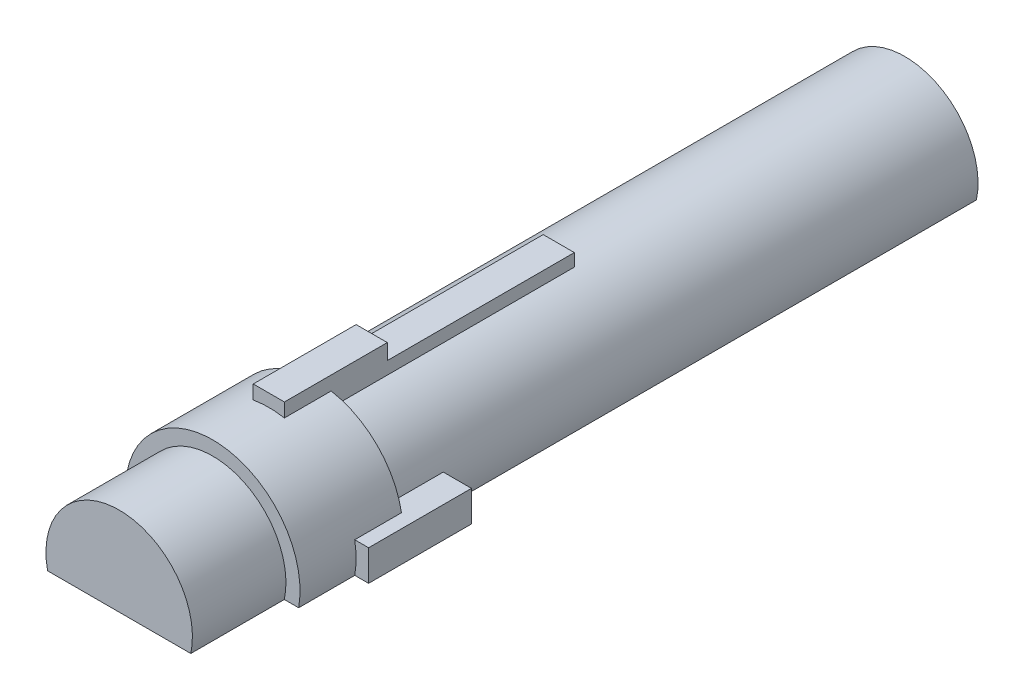
ISO-10303-21;
HEADER;
FILE_DESCRIPTION(('STEP AP214'),'2;1');
FILE_NAME('part.step','',(''),(''),'','','');
FILE_SCHEMA(('AUTOMOTIVE_DESIGN { 1 0 10303 214 1 1 1 1 }'));
ENDSEC;
DATA;
#1=APPLICATION_CONTEXT('core data for automotive mechanical design processes');
#2=APPLICATION_PROTOCOL_DEFINITION('international standard','automotive_design',2000,#1);
#3=PRODUCT_CONTEXT('',#1,'mechanical');
#4=PRODUCT('Part','Part','',(#3));
#5=PRODUCT_RELATED_PRODUCT_CATEGORY('part','',(#4));
#6=PRODUCT_DEFINITION_FORMATION('','',#4);
#7=PRODUCT_DEFINITION_CONTEXT('part definition',#1,'design');
#8=PRODUCT_DEFINITION('design','',#6,#7);
#9=PRODUCT_DEFINITION_SHAPE('','',#8);
#10=(LENGTH_UNIT() NAMED_UNIT(*) SI_UNIT(.MILLI.,.METRE.));
#11=(NAMED_UNIT(*) PLANE_ANGLE_UNIT() SI_UNIT($,.RADIAN.));
#12=(NAMED_UNIT(*) SI_UNIT($,.STERADIAN.) SOLID_ANGLE_UNIT());
#13=UNCERTAINTY_MEASURE_WITH_UNIT(LENGTH_MEASURE(1.E-05),#10,'distance_accuracy_value','');
#14=(GEOMETRIC_REPRESENTATION_CONTEXT(3) GLOBAL_UNCERTAINTY_ASSIGNED_CONTEXT((#13)) GLOBAL_UNIT_ASSIGNED_CONTEXT((#10,
#11,#12)) REPRESENTATION_CONTEXT('',''));
#15=CARTESIAN_POINT('',(0.,0.,0.));
#16=DIRECTION('',(0.,0.,1.));
#17=DIRECTION('',(1.,0.,0.));
#18=AXIS2_PLACEMENT_3D('',#15,#16,#17);
#19=CARTESIAN_POINT('',(0.,0.,42.));
#20=DIRECTION('',(0.,0.,-1.));
#21=DIRECTION('',(-1.,0.,0.));
#22=AXIS2_PLACEMENT_3D('',#19,#20,#21);
#23=CYLINDRICAL_SURFACE('',#22,3.915);
#24=CARTESIAN_POINT('',(0.,0.,18.5));
#25=DIRECTION('',(0.,0.,-1.));
#26=DIRECTION('',(-1.,0.,0.));
#27=AXIS2_PLACEMENT_3D('',#24,#25,#26);
#28=CIRCLE('',#27,3.915);
#29=CARTESIAN_POINT('',(-0.8333333333,3.82528176159758,18.5));
#30=VERTEX_POINT('',#29);
#31=CARTESIAN_POINT('',(0.8333333333,3.82528176159758,18.5));
#32=VERTEX_POINT('',#31);
#33=EDGE_CURVE('E11',#30,#32,#28,.T.);
#34=ORIENTED_EDGE('',*,*,#33,.T.);
#35=DIRECTION('',(0.,0.,1.));
#36=VECTOR('',#35,1.);
#37=CARTESIAN_POINT('',(0.833333333329999,3.82528176159105,28.5));
#38=LINE('',#37,#36);
#39=CARTESIAN_POINT('',(0.833333333329999,3.82528176159105,31.5));
#40=VERTEX_POINT('',#39);
#41=EDGE_CURVE('E304',#32,#40,#38,.T.);
#42=ORIENTED_EDGE('',*,*,#41,.T.);
#43=CARTESIAN_POINT('',(0.,0.,31.5));
#44=DIRECTION('',(0.,0.,1.));
#45=DIRECTION('',(1.,0.,0.));
#46=AXIS2_PLACEMENT_3D('',#43,#44,#45);
#47=CIRCLE('',#46,3.915);
#48=CARTESIAN_POINT('',(3.82528176159105,0.833333333330001,31.5));
#49=VERTEX_POINT('',#48);
#50=EDGE_CURVE('E364',#49,#40,#47,.T.);
#51=ORIENTED_EDGE('',*,*,#50,.F.);
#52=DIRECTION('',(0.,0.,1.));
#53=VECTOR('',#52,1.);
#54=CARTESIAN_POINT('',(3.82528176159105,0.833333333330001,28.5));
#55=LINE('',#54,#53);
#56=CARTESIAN_POINT('',(3.82528176159105,0.833333333330001,28.5));
#57=VERTEX_POINT('',#56);
#58=EDGE_CURVE('E308',#57,#49,#55,.T.);
#59=ORIENTED_EDGE('',*,*,#58,.F.);
#60=CARTESIAN_POINT('',(0.,0.,28.5));
#61=DIRECTION('',(0.,0.,-1.));
#62=DIRECTION('',(-1.,0.,0.));
#63=AXIS2_PLACEMENT_3D('',#60,#61,#62);
#64=CIRCLE('',#63,3.915);
#65=CARTESIAN_POINT('',(3.82909661139217,-0.815625,28.5));
#66=VERTEX_POINT('',#65);
#67=EDGE_CURVE('E336',#57,#66,#64,.T.);
#68=ORIENTED_EDGE('',*,*,#67,.T.);
#69=DIRECTION('',(0.,0.,-1.));
#70=VECTOR('',#69,1.);
#71=CARTESIAN_POINT('',(3.82909661139217,-0.815625,42.));
#72=LINE('',#71,#70);
#73=CARTESIAN_POINT('',(3.82909661139217,-0.815625,0.));
#74=VERTEX_POINT('',#73);
#75=EDGE_CURVE('E373',#66,#74,#72,.T.);
#76=ORIENTED_EDGE('',*,*,#75,.T.);
#77=CARTESIAN_POINT('',(0.,0.,0.));
#78=DIRECTION('',(0.,0.,1.));
#79=DIRECTION('',(1.,0.,0.));
#80=AXIS2_PLACEMENT_3D('',#77,#78,#79);
#81=CIRCLE('',#80,3.915);
#82=CARTESIAN_POINT('',(-3.82909661139217,-0.815625,0.));
#83=VERTEX_POINT('',#82);
#84=EDGE_CURVE('E374',#74,#83,#81,.T.);
#85=ORIENTED_EDGE('',*,*,#84,.T.);
#86=DIRECTION('',(0.,0.,-1.));
#87=VECTOR('',#86,1.);
#88=CARTESIAN_POINT('',(-3.82909661139217,-0.815625,42.));
#89=LINE('',#88,#87);
#90=CARTESIAN_POINT('',(-3.82909661139217,-0.815625,28.5));
#91=VERTEX_POINT('',#90);
#92=EDGE_CURVE('E385',#91,#83,#89,.T.);
#93=ORIENTED_EDGE('',*,*,#92,.F.);
#94=CARTESIAN_POINT('',(-3.82528176159105,0.833333333329999,28.5));
#95=VERTEX_POINT('',#94);
#96=EDGE_CURVE('E332',#91,#95,#64,.T.);
#97=ORIENTED_EDGE('',*,*,#96,.T.);
#98=DIRECTION('',(0.,0.,1.));
#99=VECTOR('',#98,1.);
#100=CARTESIAN_POINT('',(-3.82528176159105,0.833333333329999,28.5));
#101=LINE('',#100,#99);
#102=CARTESIAN_POINT('',(-3.82528176159105,0.833333333329999,31.5));
#103=VERTEX_POINT('',#102);
#104=EDGE_CURVE('E290',#95,#103,#101,.T.);
#105=ORIENTED_EDGE('',*,*,#104,.T.);
#106=CARTESIAN_POINT('',(-0.83333333333,3.82528176159105,31.5));
#107=VERTEX_POINT('',#106);
#108=EDGE_CURVE('E360',#107,#103,#47,.T.);
#109=ORIENTED_EDGE('',*,*,#108,.F.);
#110=DIRECTION('',(0.,0.,1.));
#111=VECTOR('',#110,1.);
#112=CARTESIAN_POINT('',(-0.83333333333,3.82528176159105,28.5));
#113=LINE('',#112,#111);
#114=EDGE_CURVE('E294',#30,#107,#113,.T.);
#115=ORIENTED_EDGE('',*,*,#114,.F.);
#116=EDGE_LOOP('',(#34,#42,#51,#59,#68,#76,#85,#93,#97,#105,#109,#115));
#117=FACE_BOUND('',#116,.T.);
#118=ADVANCED_FACE('F45',(#117),#23,.T.);
#119=CARTESIAN_POINT('',(0.,0.,28.5));
#120=DIRECTION('',(0.,0.,-1.));
#121=DIRECTION('',(-1.,0.,0.));
#122=AXIS2_PLACEMENT_3D('',#119,#120,#121);
#123=PLANE('',#122);
#124=DIRECTION('',(0.,1.,0.));
#125=VECTOR('',#124,1.);
#126=CARTESIAN_POINT('',(0.833333333329999,5.33333333333333,28.5));
#127=LINE('',#126,#125);
#128=CARTESIAN_POINT('',(0.8333333333,4.5,28.5));
#129=VERTEX_POINT('',#128);
#130=CARTESIAN_POINT('',(0.833333333329999,5.33333333333333,28.5));
#131=VERTEX_POINT('',#130);
#132=EDGE_CURVE('E264',#129,#131,#127,.T.);
#133=ORIENTED_EDGE('',*,*,#132,.F.);
#134=DIRECTION('',(1.,0.,0.));
#135=VECTOR('',#134,1.);
#136=CARTESIAN_POINT('',(-0.8333333333,4.5,28.5));
#137=LINE('',#136,#135);
#138=CARTESIAN_POINT('',(-0.83333333333,4.5,28.5));
#139=VERTEX_POINT('',#138);
#140=EDGE_CURVE('E223',#139,#129,#137,.T.);
#141=ORIENTED_EDGE('',*,*,#140,.F.);
#142=DIRECTION('',(0.,-1.,0.));
#143=VECTOR('',#142,1.);
#144=CARTESIAN_POINT('',(-0.833333333330001,5.33333333333333,28.5));
#145=LINE('',#144,#143);
#146=CARTESIAN_POINT('',(-0.833333333330001,5.33333333333333,28.5));
#147=VERTEX_POINT('',#146);
#148=EDGE_CURVE('E209',#147,#139,#145,.T.);
#149=ORIENTED_EDGE('',*,*,#148,.F.);
#150=DIRECTION('',(-1.,0.,0.));
#151=VECTOR('',#150,1.);
#152=CARTESIAN_POINT('',(-0.833333333330001,5.33333333333333,28.5));
#153=LINE('',#152,#151);
#154=EDGE_CURVE('E267',#131,#147,#153,.T.);
#155=ORIENTED_EDGE('',*,*,#154,.F.);
#156=EDGE_LOOP('',(#133,#141,#149,#155));
#157=FACE_BOUND('',#156,.T.);
#158=ADVANCED_FACE('F494',(#157),#123,.T.);
#159=CARTESIAN_POINT('',(0.,0.,31.5));
#160=DIRECTION('',(0.,0.,1.));
#161=DIRECTION('',(1.,0.,0.));
#162=AXIS2_PLACEMENT_3D('',#159,#160,#161);
#163=PLANE('',#162);
#164=ORIENTED_EDGE('',*,*,#108,.T.);
#165=DIRECTION('',(-1.,0.,0.));
#166=VECTOR('',#165,1.);
#167=CARTESIAN_POINT('',(0.,0.83333333333,31.5));
#168=LINE('',#167,#166);
#169=CARTESIAN_POINT('',(-4.59165910458482,0.833333333329999,31.5));
#170=VERTEX_POINT('',#169);
#171=EDGE_CURVE('E328',#103,#170,#168,.T.);
#172=ORIENTED_EDGE('',*,*,#171,.T.);
#173=CARTESIAN_POINT('',(0.,0.,31.5));
#174=DIRECTION('',(0.,0.,1.));
#175=DIRECTION('',(1.,0.,0.));
#176=AXIS2_PLACEMENT_3D('',#173,#174,#175);
#177=CIRCLE('',#176,4.6666666666);
#178=CARTESIAN_POINT('',(-0.83333333333,4.59165910458482,31.5));
#179=VERTEX_POINT('',#178);
#180=EDGE_CURVE('E337',#179,#170,#177,.T.);
#181=ORIENTED_EDGE('',*,*,#180,.F.);
#182=DIRECTION('',(0.,-1.,0.));
#183=VECTOR('',#182,1.);
#184=CARTESIAN_POINT('',(-0.833333333329999,0.,31.5));
#185=LINE('',#184,#183);
#186=EDGE_CURVE('E324',#179,#107,#185,.T.);
#187=ORIENTED_EDGE('',*,*,#186,.T.);
#188=EDGE_LOOP('',(#164,#172,#181,#187));
#189=FACE_BOUND('',#188,.T.);
#190=ADVANCED_FACE('F433',(#189),#163,.F.);
#191=CARTESIAN_POINT('',(3.82909661139217,-0.815625,42.));
#192=VERTEX_POINT('',#191);
#193=CARTESIAN_POINT('',(3.82909661139217,-0.815625,37.));
#194=VERTEX_POINT('',#193);
#195=EDGE_CURVE('E381',#192,#194,#72,.T.);
#196=ORIENTED_EDGE('',*,*,#195,.T.);
#197=CARTESIAN_POINT('',(0.,0.,37.));
#198=DIRECTION('',(0.,0.,1.));
#199=DIRECTION('',(1.,0.,0.));
#200=AXIS2_PLACEMENT_3D('',#197,#198,#199);
#201=CIRCLE('',#200,3.915);
#202=CARTESIAN_POINT('',(-3.82909661139217,-0.815625,37.));
#203=VERTEX_POINT('',#202);
#204=EDGE_CURVE('E353',#194,#203,#201,.T.);
#205=ORIENTED_EDGE('',*,*,#204,.T.);
#206=CARTESIAN_POINT('',(-3.82909661139217,-0.815625,42.));
#207=VERTEX_POINT('',#206);
#208=EDGE_CURVE('E386',#207,#203,#89,.T.);
#209=ORIENTED_EDGE('',*,*,#208,.F.);
#210=CARTESIAN_POINT('',(0.,0.,42.));
#211=DIRECTION('',(0.,0.,1.));
#212=DIRECTION('',(1.,0.,0.));
#213=AXIS2_PLACEMENT_3D('',#210,#211,#212);
#214=CIRCLE('',#213,3.915);
#215=EDGE_CURVE('E365',#192,#207,#214,.T.);
#216=ORIENTED_EDGE('',*,*,#215,.F.);
#217=EDGE_LOOP('',(#196,#205,#209,#216));
#218=FACE_BOUND('',#217,.T.);
#219=ADVANCED_FACE('F47',(#218),#23,.T.);
#220=CARTESIAN_POINT('',(3.82909661139217,-0.815625,42.));
#221=DIRECTION('',(0.,1.,0.));
#222=DIRECTION('',(0.,0.,1.));
#223=AXIS2_PLACEMENT_3D('',#220,#221,#222);
#224=PLANE('',#223);
#225=DIRECTION('',(1.,0.,0.));
#226=VECTOR('',#225,1.);
#227=CARTESIAN_POINT('',(5.33333333333,-0.815625,28.5));
#228=LINE('',#227,#226);
#229=CARTESIAN_POINT('',(-5.33333333333,-0.815625,28.5));
#230=VERTEX_POINT('',#229);
#231=EDGE_CURVE('E252',#230,#91,#228,.T.);
#232=ORIENTED_EDGE('',*,*,#231,.T.);
#233=ORIENTED_EDGE('',*,*,#92,.T.);
#234=DIRECTION('',(1.,0.,0.));
#235=VECTOR('',#234,1.);
#236=CARTESIAN_POINT('',(3.82909661139217,-0.815625,0.));
#237=LINE('',#236,#235);
#238=EDGE_CURVE('E370',#83,#74,#237,.T.);
#239=ORIENTED_EDGE('',*,*,#238,.T.);
#240=ORIENTED_EDGE('',*,*,#75,.F.);
#241=CARTESIAN_POINT('',(5.33333333333,-0.815625,28.5));
#242=VERTEX_POINT('',#241);
#243=EDGE_CURVE('E251',#66,#242,#228,.T.);
#244=ORIENTED_EDGE('',*,*,#243,.T.);
#245=DIRECTION('',(0.,0.,1.));
#246=VECTOR('',#245,1.);
#247=CARTESIAN_POINT('',(5.33333333333,-0.815625,28.5));
#248=LINE('',#247,#246);
#249=CARTESIAN_POINT('',(5.33333333333,-0.815625,34.));
#250=VERTEX_POINT('',#249);
#251=EDGE_CURVE('E281',#242,#250,#248,.T.);
#252=ORIENTED_EDGE('',*,*,#251,.T.);
#253=DIRECTION('',(1.,0.,0.));
#254=VECTOR('',#253,1.);
#255=CARTESIAN_POINT('',(5.33333333333,-0.815625,34.));
#256=LINE('',#255,#254);
#257=CARTESIAN_POINT('',(4.59483771601681,-0.815625,34.));
#258=VERTEX_POINT('',#257);
#259=EDGE_CURVE('E211',#258,#250,#256,.T.);
#260=ORIENTED_EDGE('',*,*,#259,.F.);
#261=DIRECTION('',(0.,0.,1.));
#262=VECTOR('',#261,1.);
#263=CARTESIAN_POINT('',(4.59483771601681,-0.815625,31.5));
#264=LINE('',#263,#262);
#265=CARTESIAN_POINT('',(4.59483771601681,-0.815625,37.));
#266=VERTEX_POINT('',#265);
#267=EDGE_CURVE('E350',#258,#266,#264,.T.);
#268=ORIENTED_EDGE('',*,*,#267,.T.);
#269=DIRECTION('',(1.,0.,0.));
#270=VECTOR('',#269,1.);
#271=CARTESIAN_POINT('',(4.59483771601681,-0.815625,37.));
#272=LINE('',#271,#270);
#273=EDGE_CURVE('E347',#194,#266,#272,.T.);
#274=ORIENTED_EDGE('',*,*,#273,.F.);
#275=ORIENTED_EDGE('',*,*,#195,.F.);
#276=DIRECTION('',(1.,0.,0.));
#277=VECTOR('',#276,1.);
#278=CARTESIAN_POINT('',(3.82909661139217,-0.815625,42.));
#279=LINE('',#278,#277);
#280=EDGE_CURVE('E369',#207,#192,#279,.T.);
#281=ORIENTED_EDGE('',*,*,#280,.F.);
#282=ORIENTED_EDGE('',*,*,#208,.T.);
#283=CARTESIAN_POINT('',(-4.59483771601681,-0.815624999999999,37.));
#284=VERTEX_POINT('',#283);
#285=EDGE_CURVE('E342',#284,#203,#272,.T.);
#286=ORIENTED_EDGE('',*,*,#285,.F.);
#287=DIRECTION('',(0.,0.,1.));
#288=VECTOR('',#287,1.);
#289=CARTESIAN_POINT('',(-4.59483771601681,-0.815624999999999,31.5));
#290=LINE('',#289,#288);
#291=CARTESIAN_POINT('',(-4.59483771601681,-0.815624999999999,34.));
#292=VERTEX_POINT('',#291);
#293=EDGE_CURVE('E354',#292,#284,#290,.T.);
#294=ORIENTED_EDGE('',*,*,#293,.F.);
#295=CARTESIAN_POINT('',(-5.33333333333,-0.815625,34.));
#296=VERTEX_POINT('',#295);
#297=EDGE_CURVE('E226',#296,#292,#256,.T.);
#298=ORIENTED_EDGE('',*,*,#297,.F.);
#299=DIRECTION('',(0.,0.,1.));
#300=VECTOR('',#299,1.);
#301=CARTESIAN_POINT('',(-5.33333333333,-0.815625,28.5));
#302=LINE('',#301,#300);
#303=EDGE_CURVE('E282',#230,#296,#302,.T.);
#304=ORIENTED_EDGE('',*,*,#303,.F.);
#305=EDGE_LOOP('',(#232,#233,#239,#240,#244,#252,#260,#268,#274,#275,#281,#282,#286,#294,#298,#304));
#306=FACE_BOUND('',#305,.T.);
#307=ADVANCED_FACE('F454',(#306),#224,.F.);
#308=CARTESIAN_POINT('',(0.,0.,42.));
#309=DIRECTION('',(0.,0.,1.));
#310=DIRECTION('',(1.,0.,0.));
#311=AXIS2_PLACEMENT_3D('',#308,#309,#310);
#312=PLANE('',#311);
#313=ORIENTED_EDGE('',*,*,#215,.T.);
#314=ORIENTED_EDGE('',*,*,#280,.T.);
#315=EDGE_LOOP('',(#313,#314));
#316=FACE_BOUND('',#315,.T.);
#317=ADVANCED_FACE('F531',(#316),#312,.T.);
#318=CARTESIAN_POINT('',(0.,0.,0.));
#319=DIRECTION('',(0.,0.,1.));
#320=DIRECTION('',(1.,0.,0.));
#321=AXIS2_PLACEMENT_3D('',#318,#319,#320);
#322=PLANE('',#321);
#323=ORIENTED_EDGE('',*,*,#84,.F.);
#324=ORIENTED_EDGE('',*,*,#238,.F.);
#325=EDGE_LOOP('',(#323,#324));
#326=FACE_BOUND('',#325,.T.);
#327=ADVANCED_FACE('F526',(#326),#322,.F.);
#328=ORIENTED_EDGE('',*,*,#50,.T.);
#329=DIRECTION('',(0.,1.,0.));
#330=VECTOR('',#329,1.);
#331=CARTESIAN_POINT('',(0.833333333329999,0.,31.5));
#332=LINE('',#331,#330);
#333=CARTESIAN_POINT('',(0.833333333329999,4.59165910458482,31.5));
#334=VERTEX_POINT('',#333);
#335=EDGE_CURVE('E320',#40,#334,#332,.T.);
#336=ORIENTED_EDGE('',*,*,#335,.T.);
#337=CARTESIAN_POINT('',(4.59165910458482,0.833333333330001,31.5));
#338=VERTEX_POINT('',#337);
#339=EDGE_CURVE('E341',#338,#334,#177,.T.);
#340=ORIENTED_EDGE('',*,*,#339,.F.);
#341=DIRECTION('',(-1.,0.,0.));
#342=VECTOR('',#341,1.);
#343=CARTESIAN_POINT('',(0.,0.833333333330001,31.5));
#344=LINE('',#343,#342);
#345=EDGE_CURVE('E285',#338,#49,#344,.T.);
#346=ORIENTED_EDGE('',*,*,#345,.T.);
#347=EDGE_LOOP('',(#328,#336,#340,#346));
#348=FACE_BOUND('',#347,.T.);
#349=ADVANCED_FACE('F491',(#348),#163,.F.);
#350=CARTESIAN_POINT('',(0.,0.,37.));
#351=DIRECTION('',(0.,0.,1.));
#352=DIRECTION('',(1.,0.,0.));
#353=AXIS2_PLACEMENT_3D('',#350,#351,#352);
#354=PLANE('',#353);
#355=ORIENTED_EDGE('',*,*,#204,.F.);
#356=ORIENTED_EDGE('',*,*,#273,.T.);
#357=CARTESIAN_POINT('',(0.,0.,37.));
#358=DIRECTION('',(0.,0.,1.));
#359=DIRECTION('',(1.,0.,0.));
#360=AXIS2_PLACEMENT_3D('',#357,#358,#359);
#361=CIRCLE('',#360,4.6666666666);
#362=EDGE_CURVE('E343',#266,#284,#361,.T.);
#363=ORIENTED_EDGE('',*,*,#362,.T.);
#364=ORIENTED_EDGE('',*,*,#285,.T.);
#365=EDGE_LOOP('',(#355,#356,#363,#364));
#366=FACE_BOUND('',#365,.T.);
#367=ADVANCED_FACE('F457',(#366),#354,.T.);
#368=CARTESIAN_POINT('',(0.,0.,31.5));
#369=DIRECTION('',(0.,0.,1.));
#370=DIRECTION('',(1.,0.,0.));
#371=AXIS2_PLACEMENT_3D('',#368,#369,#370);
#372=CYLINDRICAL_SURFACE('',#371,4.6666666666);
#373=DIRECTION('',(0.,0.,1.));
#374=VECTOR('',#373,1.);
#375=CARTESIAN_POINT('',(4.59165910458482,0.833333333330001,31.5));
#376=LINE('',#375,#374);
#377=CARTESIAN_POINT('',(4.59165910458482,0.833333333330001,34.));
#378=VERTEX_POINT('',#377);
#379=EDGE_CURVE('E54',#338,#378,#376,.T.);
#380=ORIENTED_EDGE('',*,*,#379,.F.);
#381=ORIENTED_EDGE('',*,*,#339,.T.);
#382=DIRECTION('',(0.,0.,1.));
#383=VECTOR('',#382,1.);
#384=CARTESIAN_POINT('',(0.833333333329999,4.59165910458482,31.5));
#385=LINE('',#384,#383);
#386=CARTESIAN_POINT('',(0.833333333329999,4.59165910458482,34.));
#387=VERTEX_POINT('',#386);
#388=EDGE_CURVE('E399',#387,#334,#385,.F.);
#389=ORIENTED_EDGE('',*,*,#388,.F.);
#390=CARTESIAN_POINT('',(0.,0.,34.));
#391=DIRECTION('',(0.,0.,-1.));
#392=DIRECTION('',(-1.,0.,0.));
#393=AXIS2_PLACEMENT_3D('',#390,#391,#392);
#394=CIRCLE('',#393,4.6666666666);
#395=CARTESIAN_POINT('',(-0.83333333333,4.59165910458482,34.));
#396=VERTEX_POINT('',#395);
#397=EDGE_CURVE('E396',#387,#396,#394,.F.);
#398=ORIENTED_EDGE('',*,*,#397,.T.);
#399=DIRECTION('',(0.,0.,1.));
#400=VECTOR('',#399,1.);
#401=CARTESIAN_POINT('',(-0.83333333333,4.59165910458482,31.5));
#402=LINE('',#401,#400);
#403=EDGE_CURVE('E402',#179,#396,#402,.T.);
#404=ORIENTED_EDGE('',*,*,#403,.F.);
#405=ORIENTED_EDGE('',*,*,#180,.T.);
#406=DIRECTION('',(0.,0.,1.));
#407=VECTOR('',#406,1.);
#408=CARTESIAN_POINT('',(-4.59165910458482,0.833333333329999,31.5));
#409=LINE('',#408,#407);
#410=CARTESIAN_POINT('',(-4.59165910458482,0.833333333329999,34.));
#411=VERTEX_POINT('',#410);
#412=EDGE_CURVE('E394',#411,#170,#409,.F.);
#413=ORIENTED_EDGE('',*,*,#412,.F.);
#414=EDGE_CURVE('E390',#411,#292,#394,.F.);
#415=ORIENTED_EDGE('',*,*,#414,.T.);
#416=ORIENTED_EDGE('',*,*,#293,.T.);
#417=ORIENTED_EDGE('',*,*,#362,.F.);
#418=ORIENTED_EDGE('',*,*,#267,.F.);
#419=EDGE_CURVE('E395',#258,#378,#394,.F.);
#420=ORIENTED_EDGE('',*,*,#419,.T.);
#421=EDGE_LOOP('',(#380,#381,#389,#398,#404,#405,#413,#415,#416,#417,#418,#420));
#422=FACE_BOUND('',#421,.T.);
#423=ADVANCED_FACE('F416',(#422),#372,.T.);
#424=CARTESIAN_POINT('',(-5.33333333333,0.833333333329999,28.5));
#425=DIRECTION('',(-1.,0.,0.));
#426=DIRECTION('',(0.,0.,1.));
#427=AXIS2_PLACEMENT_3D('',#424,#425,#426);
#428=PLANE('',#427);
#429=ORIENTED_EDGE('',*,*,#303,.T.);
#430=DIRECTION('',(0.,-1.,0.));
#431=VECTOR('',#430,1.);
#432=CARTESIAN_POINT('',(-5.33333333333,0.833333333329999,34.));
#433=LINE('',#432,#431);
#434=CARTESIAN_POINT('',(-5.33333333333,0.833333333329999,34.));
#435=VERTEX_POINT('',#434);
#436=EDGE_CURVE('E247',#435,#296,#433,.T.);
#437=ORIENTED_EDGE('',*,*,#436,.F.);
#438=DIRECTION('',(0.,0.,1.));
#439=VECTOR('',#438,1.);
#440=CARTESIAN_POINT('',(-5.33333333333,0.833333333329999,28.5));
#441=LINE('',#440,#439);
#442=CARTESIAN_POINT('',(-5.33333333333,0.833333333329999,28.5));
#443=VERTEX_POINT('',#442);
#444=EDGE_CURVE('E286',#443,#435,#441,.T.);
#445=ORIENTED_EDGE('',*,*,#444,.F.);
#446=DIRECTION('',(0.,-1.,0.));
#447=VECTOR('',#446,1.);
#448=CARTESIAN_POINT('',(-5.33333333333,0.833333333329999,28.5));
#449=LINE('',#448,#447);
#450=EDGE_CURVE('E277',#443,#230,#449,.T.);
#451=ORIENTED_EDGE('',*,*,#450,.T.);
#452=EDGE_LOOP('',(#429,#437,#445,#451));
#453=FACE_BOUND('',#452,.T.);
#454=ADVANCED_FACE('F444',(#453),#428,.T.);
#455=CARTESIAN_POINT('',(0.,0.,34.));
#456=DIRECTION('',(0.,0.,-1.));
#457=DIRECTION('',(-1.,0.,0.));
#458=AXIS2_PLACEMENT_3D('',#455,#456,#457);
#459=PLANE('',#458);
#460=ORIENTED_EDGE('',*,*,#414,.F.);
#461=DIRECTION('',(-1.,0.,0.));
#462=VECTOR('',#461,1.);
#463=CARTESIAN_POINT('',(-3.82528176159105,0.833333333329999,34.));
#464=LINE('',#463,#462);
#465=EDGE_CURVE('E244',#411,#435,#464,.T.);
#466=ORIENTED_EDGE('',*,*,#465,.T.);
#467=ORIENTED_EDGE('',*,*,#436,.T.);
#468=ORIENTED_EDGE('',*,*,#297,.T.);
#469=EDGE_LOOP('',(#460,#466,#467,#468));
#470=FACE_BOUND('',#469,.T.);
#471=ADVANCED_FACE('F512',(#470),#459,.F.);
#472=CARTESIAN_POINT('',(-3.82528176159105,0.833333333329999,28.5));
#473=DIRECTION('',(0.,1.,0.));
#474=DIRECTION('',(-1.,0.,0.));
#475=AXIS2_PLACEMENT_3D('',#472,#473,#474);
#476=PLANE('',#475);
#477=ORIENTED_EDGE('',*,*,#171,.F.);
#478=ORIENTED_EDGE('',*,*,#104,.F.);
#479=DIRECTION('',(-1.,0.,0.));
#480=VECTOR('',#479,1.);
#481=CARTESIAN_POINT('',(-3.82528176159105,0.833333333329999,28.5));
#482=LINE('',#481,#480);
#483=EDGE_CURVE('E273',#95,#443,#482,.T.);
#484=ORIENTED_EDGE('',*,*,#483,.T.);
#485=ORIENTED_EDGE('',*,*,#444,.T.);
#486=ORIENTED_EDGE('',*,*,#465,.F.);
#487=ORIENTED_EDGE('',*,*,#412,.T.);
#488=EDGE_LOOP('',(#477,#478,#484,#485,#486,#487));
#489=FACE_BOUND('',#488,.T.);
#490=ADVANCED_FACE('F438',(#489),#476,.T.);
#491=ORIENTED_EDGE('',*,*,#96,.F.);
#492=ORIENTED_EDGE('',*,*,#231,.F.);
#493=ORIENTED_EDGE('',*,*,#450,.F.);
#494=ORIENTED_EDGE('',*,*,#483,.F.);
#495=EDGE_LOOP('',(#491,#492,#493,#494));
#496=FACE_BOUND('',#495,.T.);
#497=ADVANCED_FACE('F441',(#496),#123,.T.);
#498=CARTESIAN_POINT('',(-0.833333333330001,5.33333333333333,28.5));
#499=DIRECTION('',(0.,1.,0.));
#500=DIRECTION('',(0.,0.,1.));
#501=AXIS2_PLACEMENT_3D('',#498,#499,#500);
#502=PLANE('',#501);
#503=DIRECTION('',(0.,0.,1.));
#504=VECTOR('',#503,1.);
#505=CARTESIAN_POINT('',(-0.833333333330001,5.33333333333333,28.5));
#506=LINE('',#505,#504);
#507=CARTESIAN_POINT('',(-0.833333333330001,5.33333333333333,34.));
#508=VERTEX_POINT('',#507);
#509=EDGE_CURVE('E297',#147,#508,#506,.T.);
#510=ORIENTED_EDGE('',*,*,#509,.T.);
#511=DIRECTION('',(-1.,0.,0.));
#512=VECTOR('',#511,1.);
#513=CARTESIAN_POINT('',(-0.833333333330001,5.33333333333333,34.));
#514=LINE('',#513,#512);
#515=CARTESIAN_POINT('',(0.833333333329999,5.33333333333333,34.));
#516=VERTEX_POINT('',#515);
#517=EDGE_CURVE('E237',#516,#508,#514,.T.);
#518=ORIENTED_EDGE('',*,*,#517,.F.);
#519=DIRECTION('',(0.,0.,1.));
#520=VECTOR('',#519,1.);
#521=CARTESIAN_POINT('',(0.833333333329999,5.33333333333333,28.5));
#522=LINE('',#521,#520);
#523=EDGE_CURVE('E300',#131,#516,#522,.T.);
#524=ORIENTED_EDGE('',*,*,#523,.F.);
#525=ORIENTED_EDGE('',*,*,#154,.T.);
#526=EDGE_LOOP('',(#510,#518,#524,#525));
#527=FACE_BOUND('',#526,.T.);
#528=ADVANCED_FACE('F430',(#527),#502,.T.);
#529=ORIENTED_EDGE('',*,*,#397,.F.);
#530=DIRECTION('',(0.,1.,0.));
#531=VECTOR('',#530,1.);
#532=CARTESIAN_POINT('',(0.833333333329999,5.33333333333333,34.));
#533=LINE('',#532,#531);
#534=EDGE_CURVE('E234',#387,#516,#533,.T.);
#535=ORIENTED_EDGE('',*,*,#534,.T.);
#536=ORIENTED_EDGE('',*,*,#517,.T.);
#537=DIRECTION('',(0.,-1.,0.));
#538=VECTOR('',#537,1.);
#539=CARTESIAN_POINT('',(-0.833333333330001,5.33333333333333,34.));
#540=LINE('',#539,#538);
#541=EDGE_CURVE('E241',#508,#396,#540,.T.);
#542=ORIENTED_EDGE('',*,*,#541,.T.);
#543=EDGE_LOOP('',(#529,#535,#536,#542));
#544=FACE_BOUND('',#543,.T.);
#545=ADVANCED_FACE('F421',(#544),#459,.F.);
#546=CARTESIAN_POINT('',(0.833333333329999,5.33333333333333,28.5));
#547=DIRECTION('',(1.,0.,0.));
#548=DIRECTION('',(0.,1.,0.));
#549=AXIS2_PLACEMENT_3D('',#546,#547,#548);
#550=PLANE('',#549);
#551=ORIENTED_EDGE('',*,*,#335,.F.);
#552=ORIENTED_EDGE('',*,*,#41,.F.);
#553=DIRECTION('',(0.,-1.,0.));
#554=VECTOR('',#553,1.);
#555=CARTESIAN_POINT('',(0.8333333333,0.263903290876243,18.5));
#556=LINE('',#555,#554);
#557=CARTESIAN_POINT('',(0.8333333333,4.5,18.5));
#558=VERTEX_POINT('',#557);
#559=EDGE_CURVE('E204',#558,#32,#556,.T.);
#560=ORIENTED_EDGE('',*,*,#559,.F.);
#561=DIRECTION('',(0.,0.,1.));
#562=VECTOR('',#561,1.);
#563=CARTESIAN_POINT('',(0.8333333333,4.5,18.5));
#564=LINE('',#563,#562);
#565=EDGE_CURVE('E212',#558,#129,#564,.T.);
#566=ORIENTED_EDGE('',*,*,#565,.T.);
#567=ORIENTED_EDGE('',*,*,#132,.T.);
#568=ORIENTED_EDGE('',*,*,#523,.T.);
#569=ORIENTED_EDGE('',*,*,#534,.F.);
#570=ORIENTED_EDGE('',*,*,#388,.T.);
#571=EDGE_LOOP('',(#551,#552,#560,#566,#567,#568,#569,#570));
#572=FACE_BOUND('',#571,.T.);
#573=ADVANCED_FACE('F424',(#572),#550,.T.);
#574=CARTESIAN_POINT('',(-0.833333333330001,5.33333333333333,28.5));
#575=DIRECTION('',(-1.,0.,0.));
#576=DIRECTION('',(0.,-1.,0.));
#577=AXIS2_PLACEMENT_3D('',#574,#575,#576);
#578=PLANE('',#577);
#579=ORIENTED_EDGE('',*,*,#186,.F.);
#580=ORIENTED_EDGE('',*,*,#403,.T.);
#581=ORIENTED_EDGE('',*,*,#541,.F.);
#582=ORIENTED_EDGE('',*,*,#509,.F.);
#583=ORIENTED_EDGE('',*,*,#148,.T.);
#584=DIRECTION('',(0.,0.,1.));
#585=VECTOR('',#584,1.);
#586=CARTESIAN_POINT('',(-0.8333333333,4.5,18.5));
#587=LINE('',#586,#585);
#588=CARTESIAN_POINT('',(-0.8333333333,4.5,18.5));
#589=VERTEX_POINT('',#588);
#590=EDGE_CURVE('E61',#589,#139,#587,.T.);
#591=ORIENTED_EDGE('',*,*,#590,.F.);
#592=DIRECTION('',(0.,1.,0.));
#593=VECTOR('',#592,1.);
#594=CARTESIAN_POINT('',(-0.8333333333,0.263903290876243,18.5));
#595=LINE('',#594,#593);
#596=EDGE_CURVE('E197',#30,#589,#595,.T.);
#597=ORIENTED_EDGE('',*,*,#596,.F.);
#598=ORIENTED_EDGE('',*,*,#114,.T.);
#599=EDGE_LOOP('',(#579,#580,#581,#582,#583,#591,#597,#598));
#600=FACE_BOUND('',#599,.T.);
#601=ADVANCED_FACE('F207',(#600),#578,.T.);
#602=ORIENTED_EDGE('',*,*,#67,.F.);
#603=DIRECTION('',(-1.,0.,0.));
#604=VECTOR('',#603,1.);
#605=CARTESIAN_POINT('',(5.33333333333,0.833333333330001,28.5));
#606=LINE('',#605,#604);
#607=CARTESIAN_POINT('',(5.33333333333,0.833333333330001,28.5));
#608=VERTEX_POINT('',#607);
#609=EDGE_CURVE('E260',#608,#57,#606,.T.);
#610=ORIENTED_EDGE('',*,*,#609,.F.);
#611=DIRECTION('',(0.,1.,0.));
#612=VECTOR('',#611,1.);
#613=CARTESIAN_POINT('',(5.33333333333,0.833333333330001,28.5));
#614=LINE('',#613,#612);
#615=EDGE_CURVE('E256',#242,#608,#614,.T.);
#616=ORIENTED_EDGE('',*,*,#615,.F.);
#617=ORIENTED_EDGE('',*,*,#243,.F.);
#618=EDGE_LOOP('',(#602,#610,#616,#617));
#619=FACE_BOUND('',#618,.T.);
#620=ADVANCED_FACE('F480',(#619),#123,.T.);
#621=CARTESIAN_POINT('',(5.33333333333,0.833333333330001,28.5));
#622=DIRECTION('',(0.,1.,0.));
#623=DIRECTION('',(-1.,0.,0.));
#624=AXIS2_PLACEMENT_3D('',#621,#622,#623);
#625=PLANE('',#624);
#626=ORIENTED_EDGE('',*,*,#345,.F.);
#627=ORIENTED_EDGE('',*,*,#379,.T.);
#628=DIRECTION('',(-1.,0.,0.));
#629=VECTOR('',#628,1.);
#630=CARTESIAN_POINT('',(5.33333333333,0.833333333330001,34.));
#631=LINE('',#630,#629);
#632=CARTESIAN_POINT('',(5.33333333333,0.833333333330001,34.));
#633=VERTEX_POINT('',#632);
#634=EDGE_CURVE('E69',#633,#378,#631,.T.);
#635=ORIENTED_EDGE('',*,*,#634,.F.);
#636=DIRECTION('',(0.,0.,1.));
#637=VECTOR('',#636,1.);
#638=CARTESIAN_POINT('',(5.33333333333,0.833333333330001,28.5));
#639=LINE('',#638,#637);
#640=EDGE_CURVE('E311',#608,#633,#639,.T.);
#641=ORIENTED_EDGE('',*,*,#640,.F.);
#642=ORIENTED_EDGE('',*,*,#609,.T.);
#643=ORIENTED_EDGE('',*,*,#58,.T.);
#644=EDGE_LOOP('',(#626,#627,#635,#641,#642,#643));
#645=FACE_BOUND('',#644,.T.);
#646=ADVANCED_FACE('F477',(#645),#625,.T.);
#647=ORIENTED_EDGE('',*,*,#419,.F.);
#648=ORIENTED_EDGE('',*,*,#259,.T.);
#649=DIRECTION('',(0.,1.,0.));
#650=VECTOR('',#649,1.);
#651=CARTESIAN_POINT('',(5.33333333333,0.833333333330001,34.));
#652=LINE('',#651,#650);
#653=EDGE_CURVE('E229',#250,#633,#652,.T.);
#654=ORIENTED_EDGE('',*,*,#653,.T.);
#655=ORIENTED_EDGE('',*,*,#634,.T.);
#656=EDGE_LOOP('',(#647,#648,#654,#655));
#657=FACE_BOUND('',#656,.T.);
#658=ADVANCED_FACE('F469',(#657),#459,.F.);
#659=CARTESIAN_POINT('',(5.33333333333,0.833333333330001,28.5));
#660=DIRECTION('',(1.,0.,0.));
#661=DIRECTION('',(0.,0.,-1.));
#662=AXIS2_PLACEMENT_3D('',#659,#660,#661);
#663=PLANE('',#662);
#664=ORIENTED_EDGE('',*,*,#640,.T.);
#665=ORIENTED_EDGE('',*,*,#653,.F.);
#666=ORIENTED_EDGE('',*,*,#251,.F.);
#667=ORIENTED_EDGE('',*,*,#615,.T.);
#668=EDGE_LOOP('',(#664,#665,#666,#667));
#669=FACE_BOUND('',#668,.T.);
#670=ADVANCED_FACE('F475',(#669),#663,.T.);
#671=CARTESIAN_POINT('',(-0.8333333333,4.5,18.5));
#672=DIRECTION('',(0.,-1.,0.));
#673=DIRECTION('',(0.,0.,-1.));
#674=AXIS2_PLACEMENT_3D('',#671,#672,#673);
#675=PLANE('',#674);
#676=ORIENTED_EDGE('',*,*,#140,.T.);
#677=ORIENTED_EDGE('',*,*,#565,.F.);
#678=DIRECTION('',(1.,0.,0.));
#679=VECTOR('',#678,1.);
#680=CARTESIAN_POINT('',(-0.8333333333,4.5,18.5));
#681=LINE('',#680,#679);
#682=EDGE_CURVE('E200',#589,#558,#681,.T.);
#683=ORIENTED_EDGE('',*,*,#682,.F.);
#684=ORIENTED_EDGE('',*,*,#590,.T.);
#685=EDGE_LOOP('',(#676,#677,#683,#684));
#686=FACE_BOUND('',#685,.T.);
#687=ADVANCED_FACE('F214',(#686),#675,.F.);
#688=CARTESIAN_POINT('',(0.,0.,18.5));
#689=DIRECTION('',(0.,0.,-1.));
#690=DIRECTION('',(-1.,0.,0.));
#691=AXIS2_PLACEMENT_3D('',#688,#689,#690);
#692=PLANE('',#691);
#693=ORIENTED_EDGE('',*,*,#33,.F.);
#694=ORIENTED_EDGE('',*,*,#596,.T.);
#695=ORIENTED_EDGE('',*,*,#682,.T.);
#696=ORIENTED_EDGE('',*,*,#559,.T.);
#697=EDGE_LOOP('',(#693,#694,#695,#696));
#698=FACE_BOUND('',#697,.T.);
#699=ADVANCED_FACE('F198',(#698),#692,.T.);
#700=CLOSED_SHELL('',(#118,#158,#190,#219,#307,#317,#327,#349,#367,#423,#454,#471,#490,#497,
#528,#545,#573,#601,#620,#646,#658,#670,#687,#699));
#701=MANIFOLD_SOLID_BREP('B2',#700);
#702=ADVANCED_BREP_SHAPE_REPRESENTATION('',(#18,#701),#14);
#703=SHAPE_DEFINITION_REPRESENTATION(#9,#702);
ENDSEC;
END-ISO-10303-21;
